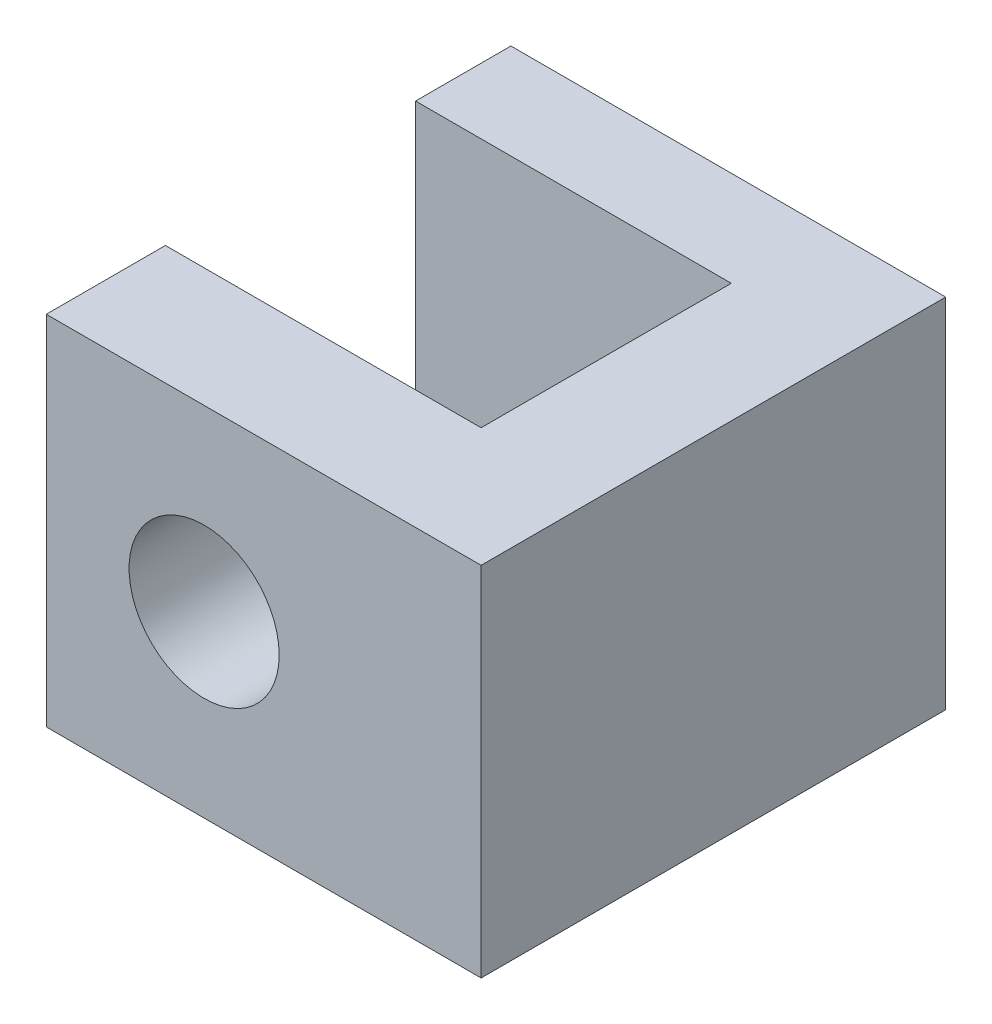
ISO-10303-21;
HEADER;
FILE_DESCRIPTION(('STEP AP214'),'2;1');
FILE_NAME('part.step','',(''),(''),'','','');
FILE_SCHEMA(('AUTOMOTIVE_DESIGN { 1 0 10303 214 1 1 1 1 }'));
ENDSEC;
DATA;
#1=APPLICATION_CONTEXT('core data for automotive mechanical design processes');
#2=APPLICATION_PROTOCOL_DEFINITION('international standard','automotive_design',2000,#1);
#3=PRODUCT_CONTEXT('',#1,'mechanical');
#4=PRODUCT('Part','Part','',(#3));
#5=PRODUCT_RELATED_PRODUCT_CATEGORY('part','',(#4));
#6=PRODUCT_DEFINITION_FORMATION('','',#4);
#7=PRODUCT_DEFINITION_CONTEXT('part definition',#1,'design');
#8=PRODUCT_DEFINITION('design','',#6,#7);
#9=PRODUCT_DEFINITION_SHAPE('','',#8);
#10=(LENGTH_UNIT() NAMED_UNIT(*) SI_UNIT(.MILLI.,.METRE.));
#11=(NAMED_UNIT(*) PLANE_ANGLE_UNIT() SI_UNIT($,.RADIAN.));
#12=(NAMED_UNIT(*) SI_UNIT($,.STERADIAN.) SOLID_ANGLE_UNIT());
#13=UNCERTAINTY_MEASURE_WITH_UNIT(LENGTH_MEASURE(1.E-05),#10,'distance_accuracy_value','');
#14=(GEOMETRIC_REPRESENTATION_CONTEXT(3) GLOBAL_UNCERTAINTY_ASSIGNED_CONTEXT((#13)) GLOBAL_UNIT_ASSIGNED_CONTEXT((#10,
#11,#12)) REPRESENTATION_CONTEXT('',''));
#15=CARTESIAN_POINT('',(0.,0.,0.));
#16=DIRECTION('',(0.,0.,1.));
#17=DIRECTION('',(1.,0.,0.));
#18=AXIS2_PLACEMENT_3D('',#15,#16,#17);
#19=CARTESIAN_POINT('',(-0.749999999999999,7.5,-15.5));
#20=DIRECTION('',(1.,0.,0.));
#21=DIRECTION('',(0.,0.,-1.));
#22=AXIS2_PLACEMENT_3D('',#19,#20,#21);
#23=PLANE('',#22);
#24=DIRECTION('',(0.,0.,1.));
#25=VECTOR('',#24,1.);
#26=CARTESIAN_POINT('',(-0.749999999999999,-7.5,-15.5));
#27=LINE('',#26,#25);
#28=CARTESIAN_POINT('',(-0.749999999999999,-7.5,-19.5));
#29=VERTEX_POINT('',#28);
#30=CARTESIAN_POINT('',(-0.749999999999999,-7.5,-15.5));
#31=VERTEX_POINT('',#30);
#32=EDGE_CURVE('E130',#29,#31,#27,.T.);
#33=ORIENTED_EDGE('',*,*,#32,.T.);
#34=DIRECTION('',(0.,-1.,0.));
#35=VECTOR('',#34,1.);
#36=CARTESIAN_POINT('',(-0.749999999999999,7.5,-15.5));
#37=LINE('',#36,#35);
#38=CARTESIAN_POINT('',(-0.749999999999999,7.5,-15.5));
#39=VERTEX_POINT('',#38);
#40=EDGE_CURVE('E41',#39,#31,#37,.T.);
#41=ORIENTED_EDGE('',*,*,#40,.F.);
#42=DIRECTION('',(0.,0.,1.));
#43=VECTOR('',#42,1.);
#44=CARTESIAN_POINT('',(-0.749999999999999,7.5,-15.5));
#45=LINE('',#44,#43);
#46=CARTESIAN_POINT('',(-0.749999999999999,7.5,-19.5));
#47=VERTEX_POINT('',#46);
#48=EDGE_CURVE('E146',#47,#39,#45,.T.);
#49=ORIENTED_EDGE('',*,*,#48,.F.);
#50=DIRECTION('',(0.,-1.,0.));
#51=VECTOR('',#50,1.);
#52=CARTESIAN_POINT('',(-0.749999999999999,7.5,-19.5));
#53=LINE('',#52,#51);
#54=EDGE_CURVE('E126',#47,#29,#53,.T.);
#55=ORIENTED_EDGE('',*,*,#54,.T.);
#56=EDGE_LOOP('',(#33,#41,#49,#55));
#57=FACE_BOUND('',#56,.T.);
#58=ADVANCED_FACE('F33',(#57),#23,.F.);
#59=CARTESIAN_POINT('',(-0.749999999999999,7.5,-15.5));
#60=DIRECTION('',(0.,0.,-1.));
#61=DIRECTION('',(-1.,0.,0.));
#62=AXIS2_PLACEMENT_3D('',#59,#60,#61);
#63=PLANE('',#62);
#64=DIRECTION('',(1.,0.,0.));
#65=VECTOR('',#64,1.);
#66=CARTESIAN_POINT('',(-0.749999999999999,-7.5,-15.5));
#67=LINE('',#66,#65);
#68=CARTESIAN_POINT('',(12.5,-7.5,-15.5));
#69=VERTEX_POINT('',#68);
#70=EDGE_CURVE('E133',#31,#69,#67,.T.);
#71=ORIENTED_EDGE('',*,*,#70,.T.);
#72=DIRECTION('',(0.,-1.,0.));
#73=VECTOR('',#72,1.);
#74=CARTESIAN_POINT('',(12.5,7.5,-15.5));
#75=LINE('',#74,#73);
#76=CARTESIAN_POINT('',(12.5,7.5,-15.5));
#77=VERTEX_POINT('',#76);
#78=EDGE_CURVE('E156',#77,#69,#75,.T.);
#79=ORIENTED_EDGE('',*,*,#78,.F.);
#80=DIRECTION('',(1.,0.,0.));
#81=VECTOR('',#80,1.);
#82=CARTESIAN_POINT('',(-0.749999999999999,7.5,-15.5));
#83=LINE('',#82,#81);
#84=EDGE_CURVE('E93',#39,#77,#83,.T.);
#85=ORIENTED_EDGE('',*,*,#84,.F.);
#86=ORIENTED_EDGE('',*,*,#40,.T.);
#87=EDGE_LOOP('',(#71,#79,#85,#86));
#88=FACE_BOUND('',#87,.T.);
#89=ADVANCED_FACE('F159',(#88),#63,.F.);
#90=CARTESIAN_POINT('',(12.5,7.5,-15.5));
#91=DIRECTION('',(1.,0.,0.));
#92=DIRECTION('',(0.,0.,-1.));
#93=AXIS2_PLACEMENT_3D('',#90,#91,#92);
#94=PLANE('',#93);
#95=DIRECTION('',(0.,0.,1.));
#96=VECTOR('',#95,1.);
#97=CARTESIAN_POINT('',(12.5,-7.5,-15.5));
#98=LINE('',#97,#96);
#99=CARTESIAN_POINT('',(12.5,-7.5,-5.));
#100=VERTEX_POINT('',#99);
#101=EDGE_CURVE('E136',#69,#100,#98,.T.);
#102=ORIENTED_EDGE('',*,*,#101,.T.);
#103=DIRECTION('',(0.,-1.,0.));
#104=VECTOR('',#103,1.);
#105=CARTESIAN_POINT('',(12.5,7.5,-5.));
#106=LINE('',#105,#104);
#107=CARTESIAN_POINT('',(12.5,7.5,-5.));
#108=VERTEX_POINT('',#107);
#109=EDGE_CURVE('E153',#108,#100,#106,.T.);
#110=ORIENTED_EDGE('',*,*,#109,.F.);
#111=DIRECTION('',(0.,0.,1.));
#112=VECTOR('',#111,1.);
#113=CARTESIAN_POINT('',(12.5,7.5,-15.5));
#114=LINE('',#113,#112);
#115=EDGE_CURVE('E176',#77,#108,#114,.T.);
#116=ORIENTED_EDGE('',*,*,#115,.F.);
#117=ORIENTED_EDGE('',*,*,#78,.T.);
#118=EDGE_LOOP('',(#102,#110,#116,#117));
#119=FACE_BOUND('',#118,.T.);
#120=ADVANCED_FACE('F169',(#119),#94,.F.);
#121=CARTESIAN_POINT('',(6.25,7.5,-5.));
#122=DIRECTION('',(0.,0.,1.));
#123=DIRECTION('',(1.,0.,0.));
#124=AXIS2_PLACEMENT_3D('',#121,#122,#123);
#125=PLANE('',#124);
#126=CARTESIAN_POINT('',(5.875,0.,-5.));
#127=DIRECTION('',(0.,0.,1.));
#128=DIRECTION('',(1.,0.,0.));
#129=AXIS2_PLACEMENT_3D('',#126,#127,#128);
#130=CIRCLE('',#129,3.15);
#131=CARTESIAN_POINT('',(9.025,0.,-5.));
#132=VERTEX_POINT('',#131);
#133=EDGE_CURVE('E134',#132,#132,#130,.T.);
#134=ORIENTED_EDGE('',*,*,#133,.T.);
#135=EDGE_LOOP('',(#134));
#136=FACE_BOUND('',#135,.T.);
#137=DIRECTION('',(-1.,0.,0.));
#138=VECTOR('',#137,1.);
#139=CARTESIAN_POINT('',(6.25,-7.5,-5.));
#140=LINE('',#139,#138);
#141=CARTESIAN_POINT('',(-0.750000000000001,-7.5,-5.));
#142=VERTEX_POINT('',#141);
#143=EDGE_CURVE('E139',#100,#142,#140,.T.);
#144=ORIENTED_EDGE('',*,*,#143,.T.);
#145=DIRECTION('',(0.,-1.,0.));
#146=VECTOR('',#145,1.);
#147=CARTESIAN_POINT('',(-0.750000000000001,7.5,-5.));
#148=LINE('',#147,#146);
#149=CARTESIAN_POINT('',(-0.750000000000001,7.5,-5.));
#150=VERTEX_POINT('',#149);
#151=EDGE_CURVE('E150',#150,#142,#148,.T.);
#152=ORIENTED_EDGE('',*,*,#151,.F.);
#153=DIRECTION('',(-1.,0.,0.));
#154=VECTOR('',#153,1.);
#155=CARTESIAN_POINT('',(12.5,7.5,-5.));
#156=LINE('',#155,#154);
#157=EDGE_CURVE('E175',#108,#150,#156,.T.);
#158=ORIENTED_EDGE('',*,*,#157,.F.);
#159=ORIENTED_EDGE('',*,*,#109,.T.);
#160=EDGE_LOOP('',(#144,#152,#158,#159));
#161=FACE_BOUND('',#160,.T.);
#162=ADVANCED_FACE('F173',(#136,#161),#125,.F.);
#163=CARTESIAN_POINT('',(-0.750000000000001,7.5,-5.));
#164=DIRECTION('',(1.,0.,0.));
#165=DIRECTION('',(0.,0.,-1.));
#166=AXIS2_PLACEMENT_3D('',#163,#164,#165);
#167=PLANE('',#166);
#168=DIRECTION('',(0.,0.,1.));
#169=VECTOR('',#168,1.);
#170=CARTESIAN_POINT('',(-0.750000000000001,-7.5,-5.));
#171=LINE('',#170,#169);
#172=CARTESIAN_POINT('',(-0.750000000000001,-7.5,0.));
#173=VERTEX_POINT('',#172);
#174=EDGE_CURVE('E141',#142,#173,#171,.T.);
#175=ORIENTED_EDGE('',*,*,#174,.T.);
#176=DIRECTION('',(0.,-1.,0.));
#177=VECTOR('',#176,1.);
#178=CARTESIAN_POINT('',(-0.750000000000001,7.5,0.));
#179=LINE('',#178,#177);
#180=CARTESIAN_POINT('',(-0.750000000000001,7.5,0.));
#181=VERTEX_POINT('',#180);
#182=EDGE_CURVE('E121',#181,#173,#179,.T.);
#183=ORIENTED_EDGE('',*,*,#182,.F.);
#184=DIRECTION('',(0.,0.,1.));
#185=VECTOR('',#184,1.);
#186=CARTESIAN_POINT('',(-0.750000000000001,7.5,-5.));
#187=LINE('',#186,#185);
#188=EDGE_CURVE('E112',#150,#181,#187,.T.);
#189=ORIENTED_EDGE('',*,*,#188,.F.);
#190=ORIENTED_EDGE('',*,*,#151,.T.);
#191=EDGE_LOOP('',(#175,#183,#189,#190));
#192=FACE_BOUND('',#191,.T.);
#193=ADVANCED_FACE('F221',(#192),#167,.F.);
#194=CARTESIAN_POINT('',(-0.750000000000001,7.5,0.));
#195=DIRECTION('',(0.,0.,-1.));
#196=DIRECTION('',(-1.,0.,0.));
#197=AXIS2_PLACEMENT_3D('',#194,#195,#196);
#198=PLANE('',#197);
#199=CARTESIAN_POINT('',(5.875,0.,0.));
#200=DIRECTION('',(0.,0.,1.));
#201=DIRECTION('',(1.,0.,0.));
#202=AXIS2_PLACEMENT_3D('',#199,#200,#201);
#203=CIRCLE('',#202,3.15);
#204=CARTESIAN_POINT('',(9.025,0.,0.));
#205=VERTEX_POINT('',#204);
#206=EDGE_CURVE('E184',#205,#205,#203,.T.);
#207=ORIENTED_EDGE('',*,*,#206,.F.);
#208=EDGE_LOOP('',(#207));
#209=FACE_BOUND('',#208,.T.);
#210=DIRECTION('',(1.,0.,0.));
#211=VECTOR('',#210,1.);
#212=CARTESIAN_POINT('',(-0.750000000000001,-7.5,0.));
#213=LINE('',#212,#211);
#214=CARTESIAN_POINT('',(17.5,-7.5,0.));
#215=VERTEX_POINT('',#214);
#216=EDGE_CURVE('E120',#173,#215,#213,.T.);
#217=ORIENTED_EDGE('',*,*,#216,.T.);
#218=DIRECTION('',(0.,-1.,0.));
#219=VECTOR('',#218,1.);
#220=CARTESIAN_POINT('',(17.5,7.5,0.));
#221=LINE('',#220,#219);
#222=CARTESIAN_POINT('',(17.5,7.5,0.));
#223=VERTEX_POINT('',#222);
#224=EDGE_CURVE('E117',#223,#215,#221,.T.);
#225=ORIENTED_EDGE('',*,*,#224,.F.);
#226=DIRECTION('',(1.,0.,0.));
#227=VECTOR('',#226,1.);
#228=CARTESIAN_POINT('',(-0.750000000000001,7.5,0.));
#229=LINE('',#228,#227);
#230=EDGE_CURVE('E106',#181,#223,#229,.T.);
#231=ORIENTED_EDGE('',*,*,#230,.F.);
#232=ORIENTED_EDGE('',*,*,#182,.T.);
#233=EDGE_LOOP('',(#217,#225,#231,#232));
#234=FACE_BOUND('',#233,.T.);
#235=ADVANCED_FACE('F118',(#209,#234),#198,.F.);
#236=CARTESIAN_POINT('',(17.5,7.5,0.));
#237=DIRECTION('',(-1.,0.,0.));
#238=DIRECTION('',(0.,0.,1.));
#239=AXIS2_PLACEMENT_3D('',#236,#237,#238);
#240=PLANE('',#239);
#241=DIRECTION('',(0.,0.,-1.));
#242=VECTOR('',#241,1.);
#243=CARTESIAN_POINT('',(17.5,-7.5,0.));
#244=LINE('',#243,#242);
#245=CARTESIAN_POINT('',(17.5,-7.5,-19.5));
#246=VERTEX_POINT('',#245);
#247=EDGE_CURVE('E78',#215,#246,#244,.T.);
#248=ORIENTED_EDGE('',*,*,#247,.T.);
#249=DIRECTION('',(0.,-1.,0.));
#250=VECTOR('',#249,1.);
#251=CARTESIAN_POINT('',(17.5,7.5,-19.5));
#252=LINE('',#251,#250);
#253=CARTESIAN_POINT('',(17.5,7.5,-19.5));
#254=VERTEX_POINT('',#253);
#255=EDGE_CURVE('E122',#254,#246,#252,.T.);
#256=ORIENTED_EDGE('',*,*,#255,.F.);
#257=DIRECTION('',(0.,0.,-1.));
#258=VECTOR('',#257,1.);
#259=CARTESIAN_POINT('',(17.5,7.5,0.));
#260=LINE('',#259,#258);
#261=EDGE_CURVE('E110',#223,#254,#260,.T.);
#262=ORIENTED_EDGE('',*,*,#261,.F.);
#263=ORIENTED_EDGE('',*,*,#224,.T.);
#264=EDGE_LOOP('',(#248,#256,#262,#263));
#265=FACE_BOUND('',#264,.T.);
#266=ADVANCED_FACE('F124',(#265),#240,.F.);
#267=CARTESIAN_POINT('',(17.5,7.5,-19.5));
#268=DIRECTION('',(0.,0.,1.));
#269=DIRECTION('',(1.,0.,0.));
#270=AXIS2_PLACEMENT_3D('',#267,#268,#269);
#271=PLANE('',#270);
#272=CARTESIAN_POINT('',(5.875,0.,-19.5));
#273=DIRECTION('',(0.,0.,1.));
#274=DIRECTION('',(1.,0.,0.));
#275=AXIS2_PLACEMENT_3D('',#272,#273,#274);
#276=CIRCLE('',#275,2.95);
#277=CARTESIAN_POINT('',(8.825,0.,-19.5));
#278=VERTEX_POINT('',#277);
#279=EDGE_CURVE('E11',#278,#278,#276,.F.);
#280=ORIENTED_EDGE('',*,*,#279,.F.);
#281=EDGE_LOOP('',(#280));
#282=FACE_BOUND('',#281,.T.);
#283=DIRECTION('',(-1.,0.,0.));
#284=VECTOR('',#283,1.);
#285=CARTESIAN_POINT('',(17.5,-7.5,-19.5));
#286=LINE('',#285,#284);
#287=EDGE_CURVE('E84',#246,#29,#286,.T.);
#288=ORIENTED_EDGE('',*,*,#287,.T.);
#289=ORIENTED_EDGE('',*,*,#54,.F.);
#290=DIRECTION('',(-1.,0.,0.));
#291=VECTOR('',#290,1.);
#292=CARTESIAN_POINT('',(17.5,7.5,-19.5));
#293=LINE('',#292,#291);
#294=EDGE_CURVE('E49',#254,#47,#293,.T.);
#295=ORIENTED_EDGE('',*,*,#294,.F.);
#296=ORIENTED_EDGE('',*,*,#255,.T.);
#297=EDGE_LOOP('',(#288,#289,#295,#296));
#298=FACE_BOUND('',#297,.T.);
#299=ADVANCED_FACE('F200',(#282,#298),#271,.F.);
#300=CARTESIAN_POINT('',(0.,7.5,0.));
#301=DIRECTION('',(0.,1.,0.));
#302=DIRECTION('',(0.,0.,1.));
#303=AXIS2_PLACEMENT_3D('',#300,#301,#302);
#304=PLANE('',#303);
#305=ORIENTED_EDGE('',*,*,#48,.T.);
#306=ORIENTED_EDGE('',*,*,#84,.T.);
#307=ORIENTED_EDGE('',*,*,#115,.T.);
#308=ORIENTED_EDGE('',*,*,#157,.T.);
#309=ORIENTED_EDGE('',*,*,#188,.T.);
#310=ORIENTED_EDGE('',*,*,#230,.T.);
#311=ORIENTED_EDGE('',*,*,#261,.T.);
#312=ORIENTED_EDGE('',*,*,#294,.T.);
#313=EDGE_LOOP('',(#305,#306,#307,#308,#309,#310,#311,#312));
#314=FACE_BOUND('',#313,.T.);
#315=ADVANCED_FACE('F108',(#314),#304,.T.);
#316=CARTESIAN_POINT('',(0.,-7.5,0.));
#317=DIRECTION('',(0.,1.,0.));
#318=DIRECTION('',(0.,0.,1.));
#319=AXIS2_PLACEMENT_3D('',#316,#317,#318);
#320=PLANE('',#319);
#321=ORIENTED_EDGE('',*,*,#32,.F.);
#322=ORIENTED_EDGE('',*,*,#287,.F.);
#323=ORIENTED_EDGE('',*,*,#247,.F.);
#324=ORIENTED_EDGE('',*,*,#216,.F.);
#325=ORIENTED_EDGE('',*,*,#174,.F.);
#326=ORIENTED_EDGE('',*,*,#143,.F.);
#327=ORIENTED_EDGE('',*,*,#101,.F.);
#328=ORIENTED_EDGE('',*,*,#70,.F.);
#329=EDGE_LOOP('',(#321,#322,#323,#324,#325,#326,#327,#328));
#330=FACE_BOUND('',#329,.T.);
#331=ADVANCED_FACE('F164',(#330),#320,.F.);
#332=CARTESIAN_POINT('',(5.875,0.,-10.));
#333=DIRECTION('',(0.,0.,1.));
#334=DIRECTION('',(1.,0.,0.));
#335=AXIS2_PLACEMENT_3D('',#332,#333,#334);
#336=CYLINDRICAL_SURFACE('',#335,3.15);
#337=ORIENTED_EDGE('',*,*,#206,.T.);
#338=EDGE_LOOP('',(#337));
#339=FACE_BOUND('',#338,.T.);
#340=ORIENTED_EDGE('',*,*,#133,.F.);
#341=EDGE_LOOP('',(#340));
#342=FACE_BOUND('',#341,.T.);
#343=ADVANCED_FACE('F196',(#339,#342),#336,.F.);
#344=CARTESIAN_POINT('',(5.875,0.,-22.4));
#345=DIRECTION('',(0.,0.,1.));
#346=DIRECTION('',(1.,0.,0.));
#347=AXIS2_PLACEMENT_3D('',#344,#345,#346);
#348=CYLINDRICAL_SURFACE('',#347,2.95);
#349=CARTESIAN_POINT('',(5.875,0.,-22.4));
#350=DIRECTION('',(0.,0.,-1.));
#351=DIRECTION('',(-1.,0.,0.));
#352=AXIS2_PLACEMENT_3D('',#349,#350,#351);
#353=CIRCLE('',#352,2.95);
#354=CARTESIAN_POINT('',(2.925,0.,-22.4));
#355=VERTEX_POINT('',#354);
#356=EDGE_CURVE('E187',#355,#355,#353,.T.);
#357=ORIENTED_EDGE('',*,*,#356,.F.);
#358=EDGE_LOOP('',(#357));
#359=FACE_BOUND('',#358,.T.);
#360=ORIENTED_EDGE('',*,*,#279,.T.);
#361=EDGE_LOOP('',(#360));
#362=FACE_BOUND('',#361,.T.);
#363=ADVANCED_FACE('F193',(#359,#362),#348,.T.);
#364=CARTESIAN_POINT('',(5.875,0.,-22.4));
#365=DIRECTION('',(0.,0.,-1.));
#366=DIRECTION('',(-1.,0.,0.));
#367=AXIS2_PLACEMENT_3D('',#364,#365,#366);
#368=PLANE('',#367);
#369=ORIENTED_EDGE('',*,*,#356,.T.);
#370=EDGE_LOOP('',(#369));
#371=FACE_BOUND('',#370,.T.);
#372=ADVANCED_FACE('F191',(#371),#368,.T.);
#373=CLOSED_SHELL('',(#58,#89,#120,#162,#193,#235,#266,#299,#315,#331,#343,#363,#372));
#374=MANIFOLD_SOLID_BREP('B2',#373);
#375=ADVANCED_BREP_SHAPE_REPRESENTATION('',(#18,#374),#14);
#376=SHAPE_DEFINITION_REPRESENTATION(#9,#375);
ENDSEC;
END-ISO-10303-21;
